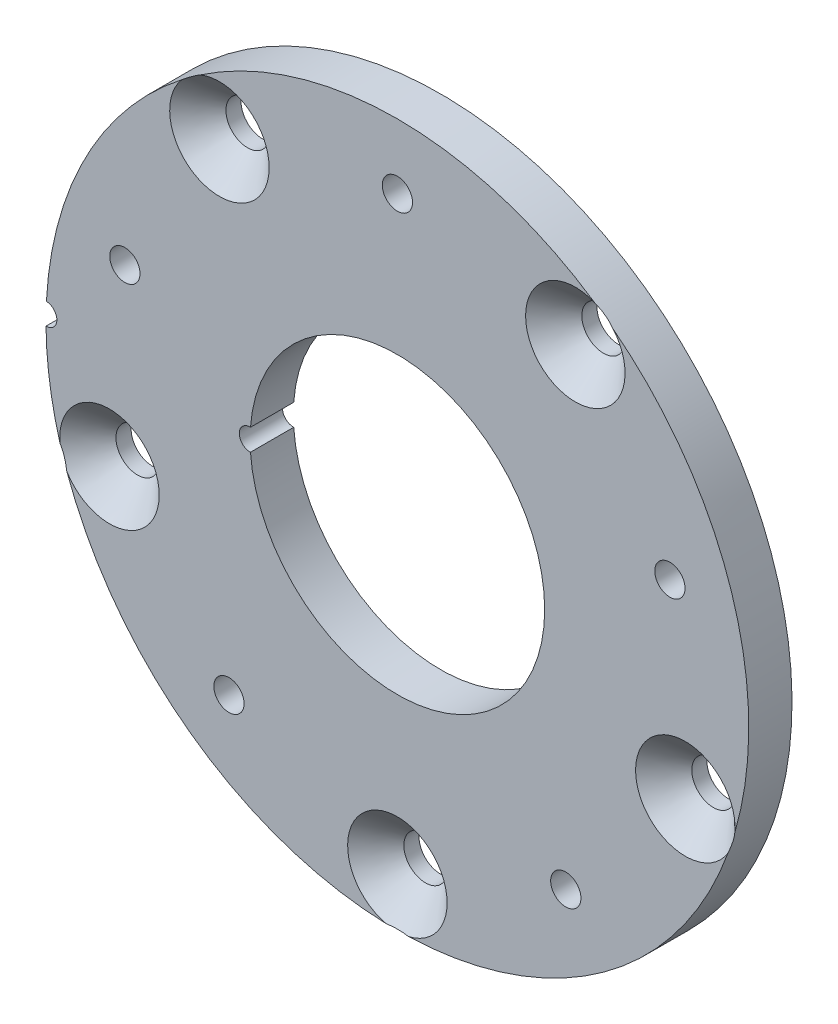
ISO-10303-21;
HEADER;
FILE_DESCRIPTION(('STEP AP214'),'2;1');
FILE_NAME('part.step','',(''),(''),'','','');
FILE_SCHEMA(('AUTOMOTIVE_DESIGN { 1 0 10303 214 1 1 1 1 }'));
ENDSEC;
DATA;
#1=APPLICATION_CONTEXT('core data for automotive mechanical design processes');
#2=APPLICATION_PROTOCOL_DEFINITION('international standard','automotive_design',2000,#1);
#3=PRODUCT_CONTEXT('',#1,'mechanical');
#4=PRODUCT('Part','Part','',(#3));
#5=PRODUCT_RELATED_PRODUCT_CATEGORY('part','',(#4));
#6=PRODUCT_DEFINITION_FORMATION('','',#4);
#7=PRODUCT_DEFINITION_CONTEXT('part definition',#1,'design');
#8=PRODUCT_DEFINITION('design','',#6,#7);
#9=PRODUCT_DEFINITION_SHAPE('','',#8);
#10=(LENGTH_UNIT() NAMED_UNIT(*) SI_UNIT(.MILLI.,.METRE.));
#11=(NAMED_UNIT(*) PLANE_ANGLE_UNIT() SI_UNIT($,.RADIAN.));
#12=(NAMED_UNIT(*) SI_UNIT($,.STERADIAN.) SOLID_ANGLE_UNIT());
#13=UNCERTAINTY_MEASURE_WITH_UNIT(LENGTH_MEASURE(1.E-05),#10,'distance_accuracy_value','');
#14=(GEOMETRIC_REPRESENTATION_CONTEXT(3) GLOBAL_UNCERTAINTY_ASSIGNED_CONTEXT((#13)) GLOBAL_UNIT_ASSIGNED_CONTEXT((#10,
#11,#12)) REPRESENTATION_CONTEXT('',''));
#15=CARTESIAN_POINT('',(0.,0.,0.));
#16=DIRECTION('',(0.,0.,1.));
#17=DIRECTION('',(1.,0.,0.));
#18=AXIS2_PLACEMENT_3D('',#15,#16,#17);
#19=CARTESIAN_POINT('',(0.,0.,4.));
#20=DIRECTION('',(0.,0.,1.));
#21=DIRECTION('',(1.,0.,0.));
#22=AXIS2_PLACEMENT_3D('',#19,#20,#21);
#23=PLANE('',#22);
#24=CARTESIAN_POINT('',(26.6295824562642,-8.65247584249883,4.));
#25=DIRECTION('',(0.,0.,1.));
#26=DIRECTION('',(0.309016994374958,0.95105651629515,0.));
#27=AXIS2_PLACEMENT_3D('',#24,#25,#26);
#28=CIRCLE('',#27,4.6);
#29=CARTESIAN_POINT('',(31.2114316098965,-9.06071392665904,4.));
#30=VERTEX_POINT('',#29);
#31=CARTESIAN_POINT('',(30.5763326125087,-11.015347655396,4.));
#32=VERTEX_POINT('',#31);
#33=EDGE_CURVE('E52',#30,#32,#28,.T.);
#34=ORIENTED_EDGE('',*,*,#33,.F.);
#35=CARTESIAN_POINT('',(0.,0.,4.));
#36=DIRECTION('',(0.,0.,1.));
#37=DIRECTION('',(1.,0.,0.));
#38=AXIS2_PLACEMENT_3D('',#35,#36,#37);
#39=CIRCLE('',#38,32.5);
#40=CARTESIAN_POINT('',(19.924824569847,25.6758907510688,4.));
#41=VERTEX_POINT('',#40);
#42=EDGE_CURVE('E59',#30,#41,#39,.T.);
#43=ORIENTED_EDGE('',*,*,#42,.T.);
#44=CARTESIAN_POINT('',(16.4579870641894,22.6524758424984,4.));
#45=DIRECTION('',(0.,0.,1.));
#46=DIRECTION('',(-0.809016994374942,0.58778525229248,0.));
#47=AXIS2_PLACEMENT_3D('',#44,#45,#46);
#48=CIRCLE('',#47,4.6);
#49=CARTESIAN_POINT('',(18.2621138084647,26.8839208309853,4.));
#50=VERTEX_POINT('',#49);
#51=EDGE_CURVE('E441',#50,#41,#48,.T.);
#52=ORIENTED_EDGE('',*,*,#51,.F.);
#53=CARTESIAN_POINT('',(-18.2621138084643,26.8839208309855,4.));
#54=VERTEX_POINT('',#53);
#55=EDGE_CURVE('E122',#50,#54,#39,.T.);
#56=ORIENTED_EDGE('',*,*,#55,.T.);
#57=CARTESIAN_POINT('',(-16.4579870641891,22.6524758424986,4.));
#58=DIRECTION('',(0.,0.,1.));
#59=DIRECTION('',(-0.809016994374951,-0.587785252292469,0.));
#60=AXIS2_PLACEMENT_3D('',#57,#58,#59);
#61=CIRCLE('',#60,4.6);
#62=CARTESIAN_POINT('',(-19.9248245698466,25.6758907510691,4.));
#63=VERTEX_POINT('',#62);
#64=EDGE_CURVE('E451',#63,#54,#61,.T.);
#65=ORIENTED_EDGE('',*,*,#64,.F.);
#66=CARTESIAN_POINT('',(-32.4582399805729,1.64701468224688,4.));
#67=VERTEX_POINT('',#66);
#68=EDGE_CURVE('E126',#63,#67,#39,.T.);
#69=ORIENTED_EDGE('',*,*,#68,.T.);
#70=CARTESIAN_POINT('',(-32.4935465104058,0.647638152128651,4.));
#71=DIRECTION('',(0.,0.,1.));
#72=DIRECTION('',(1.,0.,0.));
#73=AXIS2_PLACEMENT_3D('',#70,#71,#72);
#74=CIRCLE('',#73,0.999999999999998);
#75=CARTESIAN_POINT('',(-32.4980899192821,-0.352351526535974,4.));
#76=VERTEX_POINT('',#75);
#77=EDGE_CURVE('E220',#76,#67,#74,.T.);
#78=ORIENTED_EDGE('',*,*,#77,.F.);
#79=CARTESIAN_POINT('',(-31.2114316098967,-9.06071392665856,4.));
#80=VERTEX_POINT('',#79);
#81=EDGE_CURVE('E124',#76,#80,#39,.T.);
#82=ORIENTED_EDGE('',*,*,#81,.T.);
#83=CARTESIAN_POINT('',(-26.6295824562643,-8.65247584249845,4.));
#84=DIRECTION('',(0.,0.,1.));
#85=DIRECTION('',(0.309016994374945,-0.951056516295155,0.));
#86=AXIS2_PLACEMENT_3D('',#83,#84,#85);
#87=CIRCLE('',#86,4.6);
#88=CARTESIAN_POINT('',(-30.5763326125088,-11.0153476553956,4.));
#89=VERTEX_POINT('',#88);
#90=EDGE_CURVE('E465',#89,#80,#87,.T.);
#91=ORIENTED_EDGE('',*,*,#90,.F.);
#92=CARTESIAN_POINT('',(-1.02761176399453,-32.48375,4.));
#93=VERTEX_POINT('',#92);
#94=EDGE_CURVE('E125',#89,#93,#39,.T.);
#95=ORIENTED_EDGE('',*,*,#94,.T.);
#96=CARTESIAN_POINT('',(0.,-28.,4.));
#97=DIRECTION('',(0.,0.,1.));
#98=DIRECTION('',(1.,0.,0.));
#99=AXIS2_PLACEMENT_3D('',#96,#97,#98);
#100=CIRCLE('',#99,4.6);
#101=CARTESIAN_POINT('',(1.02761176399448,-32.48375,4.));
#102=VERTEX_POINT('',#101);
#103=EDGE_CURVE('E231',#102,#93,#100,.T.);
#104=ORIENTED_EDGE('',*,*,#103,.F.);
#105=EDGE_CURVE('E116',#102,#32,#39,.T.);
#106=ORIENTED_EDGE('',*,*,#105,.T.);
#107=EDGE_LOOP('',(#34,#43,#52,#56,#65,#69,#78,#82,#91,#95,#104,#106));
#108=FACE_BOUND('',#107,.T.);
#109=CARTESIAN_POINT('',(-13.625,0.,4.));
#110=DIRECTION('',(0.,0.,1.));
#111=DIRECTION('',(1.,0.,0.));
#112=AXIS2_PLACEMENT_3D('',#109,#110,#111);
#113=CIRCLE('',#112,1.);
#114=CARTESIAN_POINT('',(-13.5883027522936,0.999326429156548,4.));
#115=VERTEX_POINT('',#114);
#116=CARTESIAN_POINT('',(-13.5883027522936,-0.999326429156548,4.));
#117=VERTEX_POINT('',#116);
#118=EDGE_CURVE('E164',#115,#117,#113,.T.);
#119=ORIENTED_EDGE('',*,*,#118,.F.);
#120=CARTESIAN_POINT('',(0.,0.,4.));
#121=DIRECTION('',(0.,0.,1.));
#122=DIRECTION('',(1.,0.,0.));
#123=AXIS2_PLACEMENT_3D('',#120,#121,#122);
#124=CIRCLE('',#123,13.625);
#125=EDGE_CURVE('E143',#117,#115,#124,.T.);
#126=ORIENTED_EDGE('',*,*,#125,.F.);
#127=EDGE_LOOP('',(#119,#126));
#128=FACE_BOUND('',#127,.T.);
#129=CARTESIAN_POINT('',(25.2029976818217,8.188950350936,4.));
#130=DIRECTION('',(0.,0.,1.));
#131=DIRECTION('',(1.,0.,0.));
#132=AXIS2_PLACEMENT_3D('',#129,#130,#131);
#133=CIRCLE('',#132,1.4);
#134=CARTESIAN_POINT('',(26.6029976818217,8.188950350936,4.));
#135=VERTEX_POINT('',#134);
#136=EDGE_CURVE('E171',#135,#135,#133,.T.);
#137=ORIENTED_EDGE('',*,*,#136,.F.);
#138=EDGE_LOOP('',(#137));
#139=FACE_BOUND('',#138,.T.);
#140=CARTESIAN_POINT('',(-25.2029976818215,8.18895035093619,4.));
#141=DIRECTION('',(0.,0.,1.));
#142=DIRECTION('',(1.,0.,0.));
#143=AXIS2_PLACEMENT_3D('',#140,#141,#142);
#144=CIRCLE('',#143,1.4);
#145=CARTESIAN_POINT('',(-23.8029976818215,8.18895035093619,4.));
#146=VERTEX_POINT('',#145);
#147=EDGE_CURVE('E183',#146,#146,#144,.T.);
#148=ORIENTED_EDGE('',*,*,#147,.F.);
#149=EDGE_LOOP('',(#148));
#150=FACE_BOUND('',#149,.T.);
#151=CARTESIAN_POINT('',(-15.5763091857506,-21.4389503509361,4.));
#152=DIRECTION('',(0.,0.,1.));
#153=DIRECTION('',(1.,0.,0.));
#154=AXIS2_PLACEMENT_3D('',#151,#152,#153);
#155=CIRCLE('',#154,1.4);
#156=CARTESIAN_POINT('',(-14.1763091857506,-21.4389503509361,4.));
#157=VERTEX_POINT('',#156);
#158=EDGE_CURVE('E189',#157,#157,#155,.T.);
#159=ORIENTED_EDGE('',*,*,#158,.F.);
#160=EDGE_LOOP('',(#159));
#161=FACE_BOUND('',#160,.T.);
#162=CARTESIAN_POINT('',(1.54620020931789E-13,26.5,4.));
#163=DIRECTION('',(0.,0.,1.));
#164=DIRECTION('',(1.,0.,0.));
#165=AXIS2_PLACEMENT_3D('',#162,#163,#164);
#166=CIRCLE('',#165,1.4);
#167=CARTESIAN_POINT('',(1.40000000000015,26.5,4.));
#168=VERTEX_POINT('',#167);
#169=EDGE_CURVE('E177',#168,#168,#166,.T.);
#170=ORIENTED_EDGE('',*,*,#169,.F.);
#171=EDGE_LOOP('',(#170));
#172=FACE_BOUND('',#171,.T.);
#173=CARTESIAN_POINT('',(15.5763091857505,-21.4389503509362,4.));
#174=DIRECTION('',(0.,0.,1.));
#175=DIRECTION('',(1.,0.,0.));
#176=AXIS2_PLACEMENT_3D('',#173,#174,#175);
#177=CIRCLE('',#176,1.4);
#178=CARTESIAN_POINT('',(16.9763091857505,-21.4389503509362,4.));
#179=VERTEX_POINT('',#178);
#180=EDGE_CURVE('E161',#179,#179,#177,.T.);
#181=ORIENTED_EDGE('',*,*,#180,.F.);
#182=EDGE_LOOP('',(#181));
#183=FACE_BOUND('',#182,.T.);
#184=ADVANCED_FACE('F37',(#108,#128,#139,#150,#161,#172,#183),#23,.T.);
#185=CARTESIAN_POINT('',(0.,0.,0.));
#186=DIRECTION('',(0.,0.,1.));
#187=DIRECTION('',(1.,0.,0.));
#188=AXIS2_PLACEMENT_3D('',#185,#186,#187);
#189=PLANE('',#188);
#190=CARTESIAN_POINT('',(0.,0.,0.));
#191=DIRECTION('',(0.,0.,1.));
#192=DIRECTION('',(1.,0.,0.));
#193=AXIS2_PLACEMENT_3D('',#190,#191,#192);
#194=CIRCLE('',#193,32.5);
#195=CARTESIAN_POINT('',(-32.4980899192821,-0.352351526535974,0.));
#196=VERTEX_POINT('',#195);
#197=CARTESIAN_POINT('',(-32.4582399805729,1.64701468224705,0.));
#198=VERTEX_POINT('',#197);
#199=EDGE_CURVE('E138',#196,#198,#194,.T.);
#200=ORIENTED_EDGE('',*,*,#199,.F.);
#201=CARTESIAN_POINT('',(-32.4935465104058,0.647638152128651,0.));
#202=DIRECTION('',(0.,0.,1.));
#203=DIRECTION('',(1.,0.,0.));
#204=AXIS2_PLACEMENT_3D('',#201,#202,#203);
#205=CIRCLE('',#204,0.999999999999998);
#206=EDGE_CURVE('E156',#196,#198,#205,.T.);
#207=ORIENTED_EDGE('',*,*,#206,.T.);
#208=EDGE_LOOP('',(#200,#207));
#209=FACE_BOUND('',#208,.T.);
#210=CARTESIAN_POINT('',(0.,0.,0.));
#211=DIRECTION('',(0.,0.,1.));
#212=DIRECTION('',(1.,0.,0.));
#213=AXIS2_PLACEMENT_3D('',#210,#211,#212);
#214=CIRCLE('',#213,13.625);
#215=CARTESIAN_POINT('',(-13.5883027522936,-0.999326429156545,0.));
#216=VERTEX_POINT('',#215);
#217=CARTESIAN_POINT('',(-13.5883027522936,0.999326429156542,0.));
#218=VERTEX_POINT('',#217);
#219=EDGE_CURVE('E147',#216,#218,#214,.T.);
#220=ORIENTED_EDGE('',*,*,#219,.T.);
#221=CARTESIAN_POINT('',(-13.625,0.,0.));
#222=DIRECTION('',(0.,0.,1.));
#223=DIRECTION('',(1.,0.,0.));
#224=AXIS2_PLACEMENT_3D('',#221,#222,#223);
#225=CIRCLE('',#224,1.);
#226=EDGE_CURVE('E158',#218,#216,#225,.T.);
#227=ORIENTED_EDGE('',*,*,#226,.T.);
#228=EDGE_LOOP('',(#220,#227));
#229=FACE_BOUND('',#228,.T.);
#230=CARTESIAN_POINT('',(0.,-28.,0.));
#231=DIRECTION('',(0.,0.,1.));
#232=DIRECTION('',(1.,0.,0.));
#233=AXIS2_PLACEMENT_3D('',#230,#231,#232);
#234=CIRCLE('',#233,2.);
#235=CARTESIAN_POINT('',(1.99999999999999,-28.,0.));
#236=VERTEX_POINT('',#235);
#237=EDGE_CURVE('E206',#236,#236,#234,.T.);
#238=ORIENTED_EDGE('',*,*,#237,.T.);
#239=EDGE_LOOP('',(#238));
#240=FACE_BOUND('',#239,.T.);
#241=CARTESIAN_POINT('',(-26.6295824562643,-8.65247584249846,0.));
#242=DIRECTION('',(0.,0.,1.));
#243=DIRECTION('',(1.,0.,0.));
#244=AXIS2_PLACEMENT_3D('',#241,#242,#243);
#245=CIRCLE('',#244,2.);
#246=CARTESIAN_POINT('',(-24.6295824562643,-8.65247584249846,0.));
#247=VERTEX_POINT('',#246);
#248=EDGE_CURVE('E203',#247,#247,#245,.T.);
#249=ORIENTED_EDGE('',*,*,#248,.T.);
#250=EDGE_LOOP('',(#249));
#251=FACE_BOUND('',#250,.T.);
#252=CARTESIAN_POINT('',(-16.4579870641891,22.6524758424986,0.));
#253=DIRECTION('',(0.,0.,1.));
#254=DIRECTION('',(1.,0.,0.));
#255=AXIS2_PLACEMENT_3D('',#252,#253,#254);
#256=CIRCLE('',#255,2.);
#257=CARTESIAN_POINT('',(-14.4579870641891,22.6524758424986,0.));
#258=VERTEX_POINT('',#257);
#259=EDGE_CURVE('E200',#258,#258,#256,.T.);
#260=ORIENTED_EDGE('',*,*,#259,.T.);
#261=EDGE_LOOP('',(#260));
#262=FACE_BOUND('',#261,.T.);
#263=CARTESIAN_POINT('',(16.4579870641894,22.6524758424984,0.));
#264=DIRECTION('',(0.,0.,1.));
#265=DIRECTION('',(1.,0.,0.));
#266=AXIS2_PLACEMENT_3D('',#263,#264,#265);
#267=CIRCLE('',#266,2.);
#268=CARTESIAN_POINT('',(18.4579870641894,22.6524758424984,0.));
#269=VERTEX_POINT('',#268);
#270=EDGE_CURVE('E197',#269,#269,#267,.T.);
#271=ORIENTED_EDGE('',*,*,#270,.T.);
#272=EDGE_LOOP('',(#271));
#273=FACE_BOUND('',#272,.T.);
#274=CARTESIAN_POINT('',(26.6295824562642,-8.65247584249883,0.));
#275=DIRECTION('',(0.,0.,1.));
#276=DIRECTION('',(1.,0.,0.));
#277=AXIS2_PLACEMENT_3D('',#274,#275,#276);
#278=CIRCLE('',#277,2.);
#279=CARTESIAN_POINT('',(28.6295824562642,-8.65247584249883,0.));
#280=VERTEX_POINT('',#279);
#281=EDGE_CURVE('E192',#280,#280,#278,.T.);
#282=ORIENTED_EDGE('',*,*,#281,.T.);
#283=EDGE_LOOP('',(#282));
#284=FACE_BOUND('',#283,.T.);
#285=CARTESIAN_POINT('',(-15.5763091857506,-21.4389503509361,0.));
#286=DIRECTION('',(0.,0.,1.));
#287=DIRECTION('',(1.,0.,0.));
#288=AXIS2_PLACEMENT_3D('',#285,#286,#287);
#289=CIRCLE('',#288,1.4);
#290=CARTESIAN_POINT('',(-14.1763091857506,-21.4389503509361,0.));
#291=VERTEX_POINT('',#290);
#292=EDGE_CURVE('E186',#291,#291,#289,.T.);
#293=ORIENTED_EDGE('',*,*,#292,.T.);
#294=EDGE_LOOP('',(#293));
#295=FACE_BOUND('',#294,.T.);
#296=CARTESIAN_POINT('',(-25.2029976818215,8.18895035093619,0.));
#297=DIRECTION('',(0.,0.,1.));
#298=DIRECTION('',(1.,0.,0.));
#299=AXIS2_PLACEMENT_3D('',#296,#297,#298);
#300=CIRCLE('',#299,1.4);
#301=CARTESIAN_POINT('',(-23.8029976818215,8.18895035093619,0.));
#302=VERTEX_POINT('',#301);
#303=EDGE_CURVE('E180',#302,#302,#300,.T.);
#304=ORIENTED_EDGE('',*,*,#303,.T.);
#305=EDGE_LOOP('',(#304));
#306=FACE_BOUND('',#305,.T.);
#307=CARTESIAN_POINT('',(1.54620020931789E-13,26.5,0.));
#308=DIRECTION('',(0.,0.,1.));
#309=DIRECTION('',(1.,0.,0.));
#310=AXIS2_PLACEMENT_3D('',#307,#308,#309);
#311=CIRCLE('',#310,1.4);
#312=CARTESIAN_POINT('',(1.40000000000015,26.5,0.));
#313=VERTEX_POINT('',#312);
#314=EDGE_CURVE('E174',#313,#313,#311,.T.);
#315=ORIENTED_EDGE('',*,*,#314,.T.);
#316=EDGE_LOOP('',(#315));
#317=FACE_BOUND('',#316,.T.);
#318=CARTESIAN_POINT('',(25.2029976818217,8.188950350936,0.));
#319=DIRECTION('',(0.,0.,1.));
#320=DIRECTION('',(1.,0.,0.));
#321=AXIS2_PLACEMENT_3D('',#318,#319,#320);
#322=CIRCLE('',#321,1.4);
#323=CARTESIAN_POINT('',(26.6029976818217,8.188950350936,0.));
#324=VERTEX_POINT('',#323);
#325=EDGE_CURVE('E169',#324,#324,#322,.T.);
#326=ORIENTED_EDGE('',*,*,#325,.T.);
#327=EDGE_LOOP('',(#326));
#328=FACE_BOUND('',#327,.T.);
#329=CARTESIAN_POINT('',(15.5763091857505,-21.4389503509362,0.));
#330=DIRECTION('',(0.,0.,1.));
#331=DIRECTION('',(1.,0.,0.));
#332=AXIS2_PLACEMENT_3D('',#329,#330,#331);
#333=CIRCLE('',#332,1.4);
#334=CARTESIAN_POINT('',(16.9763091857505,-21.4389503509362,0.));
#335=VERTEX_POINT('',#334);
#336=EDGE_CURVE('E157',#335,#335,#333,.T.);
#337=ORIENTED_EDGE('',*,*,#336,.T.);
#338=EDGE_LOOP('',(#337));
#339=FACE_BOUND('',#338,.T.);
#340=ADVANCED_FACE('F154',(#209,#229,#240,#251,#262,#273,#284,#295,#306,#317,#328,#339),#189,.F.);
#341=CARTESIAN_POINT('',(0.,0.,4.));
#342=DIRECTION('',(0.,0.,-1.));
#343=DIRECTION('',(-1.,0.,0.));
#344=AXIS2_PLACEMENT_3D('',#341,#342,#343);
#345=CYLINDRICAL_SURFACE('',#344,32.5);
#346=ORIENTED_EDGE('',*,*,#42,.F.);
#347=CARTESIAN_POINT('',(29.7642821915229,-13.05134114271,4.80151445056223));
#348=CARTESIAN_POINT('',(29.7990954753925,-12.9719464974156,4.75706565626101));
#349=CARTESIAN_POINT('',(29.8337921862947,-12.8919561239771,4.7135922698184));
#350=CARTESIAN_POINT('',(29.9029638009744,-12.7306897995468,4.62885638173554));
#351=CARTESIAN_POINT('',(29.9374386455946,-12.6494135241654,4.58759444987117));
#352=CARTESIAN_POINT('',(30.0407354269776,-12.4030640163051,4.46729963383827));
#353=CARTESIAN_POINT('',(30.1092120263845,-12.2359654356075,4.39203901050532));
#354=CARTESIAN_POINT('',(30.2449481691323,-11.8964887970887,4.25447046684947));
#355=CARTESIAN_POINT('',(30.3122101393635,-11.7241236983948,4.19213329443923));
#356=CARTESIAN_POINT('',(30.4452972298894,-11.3740428620976,4.08343940363289));
#357=CARTESIAN_POINT('',(30.5111240865307,-11.1963342895338,4.03706224002949));
#358=CARTESIAN_POINT('',(30.625798218446,-10.8780556779291,3.97188531633565));
#359=CARTESIAN_POINT('',(30.6750433406051,-10.7384289761772,3.94918454061495));
#360=CARTESIAN_POINT('',(30.772059114663,-10.4571743379573,3.9161059294156));
#361=CARTESIAN_POINT('',(30.8198296406019,-10.3155462320276,3.90572914382985));
#362=CARTESIAN_POINT('',(30.91345580336,-10.0314797995512,3.89787763744971));
#363=CARTESIAN_POINT('',(30.9593136019127,-9.88904260642992,3.90038793037042));
#364=CARTESIAN_POINT('',(31.0488250920257,-9.60430845773261,3.9181282488439));
#365=CARTESIAN_POINT('',(31.0924790707949,-9.46201148626471,3.93335661237586));
#366=CARTESIAN_POINT('',(31.189249567325,-9.13874088146984,3.98169045081677));
#367=CARTESIAN_POINT('',(31.2415894063599,-8.95810404197802,4.01860993030227));
#368=CARTESIAN_POINT('',(31.3421221908425,-8.59977290554906,4.10936636804301));
#369=CARTESIAN_POINT('',(31.3903092934516,-8.42208302972639,4.16322668223493));
#370=CARTESIAN_POINT('',(31.4829218127849,-8.0690301239286,4.28522390764091));
#371=CARTESIAN_POINT('',(31.5273130937003,-7.89369817940568,4.35347441213314));
#372=CARTESIAN_POINT('',(31.6119933462984,-7.54741522301577,4.50093199539019));
#373=CARTESIAN_POINT('',(31.6522960570481,-7.37645108832062,4.58010011684573));
#374=CARTESIAN_POINT('',(31.6907607950203,-7.20733516861825,4.66345492466674));
#375=B_SPLINE_CURVE_WITH_KNOTS('',3,(#347,#348,#349,#350,#351,#352,#353,#354,#355,#356,#357,
#358,#359,#360,#361,#362,#363,#364,#365,#366,#367,#368,#369,#370,#371,#372,#373,#374),
.UNSPECIFIED.,.F.,.F.,(4,2,2,2,2,2,2,2,2,2,2,2,2,4),(0.,0.292254819691221,0.584584579673453,
1.17107092677199,1.75621491455109,2.34060650198234,2.78949031699162,3.23841237011422,
3.68681249355796,4.13515402841842,4.70914235390499,5.28392551833602,5.8634282028859,
6.44091412228892),.UNSPECIFIED.);
#376=EDGE_CURVE('E107',#30,#32,#375,.F.);
#377=ORIENTED_EDGE('',*,*,#376,.T.);
#378=ORIENTED_EDGE('',*,*,#105,.F.);
#379=CARTESIAN_POINT('',(2.18761147687946,-32.4262911235039,4.33737755126989));
#380=CARTESIAN_POINT('',(2.09392339413747,-32.4326111129845,4.30153893209606));
#381=CARTESIAN_POINT('',(1.99958106501111,-32.4385683271193,4.26736311533428));
#382=CARTESIAN_POINT('',(1.80952219744727,-32.4497259358619,4.20274766679111));
#383=CARTESIAN_POINT('',(1.71380488412545,-32.4549258837221,4.17231024211095));
#384=CARTESIAN_POINT('',(1.42362940338324,-32.4693835891835,4.08698028514288));
#385=CARTESIAN_POINT('',(1.22714799405356,-32.4774309221458,4.03846227431315));
#386=CARTESIAN_POINT('',(0.881592837675937,-32.4883742806242,3.97185344035491));
#387=CARTESIAN_POINT('',(0.73342890122717,-32.4920648200495,3.94913581277253));
#388=CARTESIAN_POINT('',(0.435627077287493,-32.4974213151129,3.91604774106234));
#389=CARTESIAN_POINT('',(0.285988902893382,-32.4990868684938,3.90567975015933));
#390=CARTESIAN_POINT('',(-0.0131395925682458,-32.50034046349,3.8978828125145));
#391=CARTESIAN_POINT('',(-0.162628801430454,-32.4999352698523,3.90041173389155));
#392=CARTESIAN_POINT('',(-0.46076951465051,-32.4970752348678,3.91817038711729));
#393=CARTESIAN_POINT('',(-0.60942139569541,-32.4946214041906,3.93339385626411));
#394=CARTESIAN_POINT('',(-0.802587960114542,-32.4901204174539,3.96106299954777));
#395=CARTESIAN_POINT('',(-0.847945584161226,-32.4889679517612,3.96813446268651));
#396=CARTESIAN_POINT('',(-0.938452342538747,-32.4864795838151,3.98336137216999));
#397=CARTESIAN_POINT('',(-0.98360156342662,-32.4851437664625,3.99151631675431));
#398=CARTESIAN_POINT('',(-1.21942079098708,-32.4776756682963,4.03697369332571));
#399=CARTESIAN_POINT('',(-1.40838256964405,-32.4700057020977,4.08322955410041));
#400=CARTESIAN_POINT('',(-1.78162105507351,-32.4516692381705,4.19160061006673));
#401=CARTESIAN_POINT('',(-1.96589251800099,-32.4409995344591,4.25373276660941));
#402=CARTESIAN_POINT('',(-2.33044003473332,-32.4168567948062,4.39106744432792));
#403=CARTESIAN_POINT('',(-2.51068793137564,-32.403368392982,4.4663412194918));
#404=CARTESIAN_POINT('',(-2.86630546106086,-32.3738493773682,4.62693861356627));
#405=CARTESIAN_POINT('',(-3.04167661824324,-32.3578195685894,4.71225904792318));
#406=CARTESIAN_POINT('',(-3.43434892285811,-32.3187856394079,4.91459509950438));
#407=CARTESIAN_POINT('',(-3.65034678795546,-32.2950620212775,5.03399184547994));
#408=CARTESIAN_POINT('',(-3.96880432382042,-32.2569349366156,5.21940150205408));
#409=CARTESIAN_POINT('',(-4.07350186700296,-32.2438768767346,5.28191506257402));
#410=CARTESIAN_POINT('',(-4.28156490962763,-32.216908560319,5.40892305131055));
#411=CARTESIAN_POINT('',(-4.38493053350623,-32.2029983841036,5.47341729254628));
#412=CARTESIAN_POINT('',(-4.48769978419368,-32.1886711537918,5.53876334351306));
#413=B_SPLINE_CURVE_WITH_KNOTS('',3,(#379,#380,#381,#382,#383,#384,#385,#386,#387,#388,#389,
#390,#391,#392,#393,#394,#395,#396,#397,#398,#399,#400,#401,#402,#403,#404,#405,#406,#407,#408,
#409,#410,#411,#412),.UNSPECIFIED.,.F.,.F.,(4,2,2,2,2,2,2,2,2,2,2,2,2,2,2,2,4),(0.,
0.301485882887291,0.603148912406607,1.20969485911814,1.65905369009797,2.10850177022017,
2.55648252712252,3.00424240878819,3.14199402554852,3.27968207043328,3.86276390264171,
4.44647129067722,5.03344783681443,5.62023882357679,6.36366391174606,6.73155944677986,
7.09942035773564),.UNSPECIFIED.);
#414=EDGE_CURVE('E222',#102,#93,#413,.T.);
#415=ORIENTED_EDGE('',*,*,#414,.T.);
#416=ORIENTED_EDGE('',*,*,#94,.F.);
#417=CARTESIAN_POINT('',(-30.5759805592863,-11.0163248335435,4.0002));
#418=CARTESIAN_POINT('',(-30.6011931699026,-10.9463473958009,3.98586800496713));
#419=CARTESIAN_POINT('',(-30.6262575070638,-10.8760267650966,3.97297614819914));
#420=CARTESIAN_POINT('',(-30.676053560222,-10.7347727992436,3.95021002917064));
#421=CARTESIAN_POINT('',(-30.7007852349056,-10.6638393897578,3.94033613846361));
#422=CARTESIAN_POINT('',(-30.7744041508496,-10.4502963423114,3.9154568680967));
#423=CARTESIAN_POINT('',(-30.8227294310869,-10.306904649462,3.90518571828497));
#424=CARTESIAN_POINT('',(-30.9162705408148,-10.022775536683,3.89795657955918));
#425=CARTESIAN_POINT('',(-30.9615339529008,-9.88206170537228,3.90067126017088));
#426=CARTESIAN_POINT('',(-31.0498989922163,-9.60080728491697,3.91850384110028));
#427=CARTESIAN_POINT('',(-31.0930013451044,-9.46026665328687,3.9336175479667));
#428=CARTESIAN_POINT('',(-31.1885735977248,-9.14099918343215,3.9813527279751));
#429=CARTESIAN_POINT('',(-31.2402861063589,-8.96260155497331,4.0176921220049));
#430=CARTESIAN_POINT('',(-31.3396363981531,-8.60877572180096,4.10687245624813));
#431=CARTESIAN_POINT('',(-31.3872714933109,-8.43334953617779,4.15972417695593));
#432=CARTESIAN_POINT('',(-31.4564889844985,-8.16994091519101,4.25017381861741));
#433=CARTESIAN_POINT('',(-31.4795535798393,-8.08060093670968,4.28283021540552));
#434=CARTESIAN_POINT('',(-31.5246233961358,-7.902943212993,4.35136410780085));
#435=CARTESIAN_POINT('',(-31.5466291274233,-7.81462499122108,4.3872400273438));
#436=CARTESIAN_POINT('',(-31.5895470624973,-7.63928248243777,4.46172590921883));
#437=CARTESIAN_POINT('',(-31.6104629225202,-7.55225467853746,4.50032554890045));
#438=CARTESIAN_POINT('',(-31.6513285728823,-7.37911286740737,4.58006550528817));
#439=CARTESIAN_POINT('',(-31.6712781277644,-7.29299908684713,4.62120643572267));
#440=CARTESIAN_POINT('',(-31.6907607950204,-7.20733516861785,4.66345492466671));
#441=B_SPLINE_CURVE_WITH_KNOTS('',3,(#417,#418,#419,#420,#421,#422,#423,#424,#425,#426,#427,
#428,#429,#430,#431,#432,#433,#434,#435,#436,#437,#438,#439,#440),.UNSPECIFIED.,.F.,.F.,(4,2,2,
2,2,2,2,2,2,2,2,4),(0.,0.227220223808057,0.454468410320775,0.908837681842531,1.35181502821111,
1.79464261778052,2.36149429855849,2.92871683903757,3.22229780001807,3.51573581919487,
3.80811597648137,4.10056702252247),.UNSPECIFIED.);
#442=EDGE_CURVE('E467',#89,#80,#441,.T.);
#443=ORIENTED_EDGE('',*,*,#442,.T.);
#444=ORIENTED_EDGE('',*,*,#81,.F.);
#445=DIRECTION('',(0.,0.,1.));
#446=VECTOR('',#445,1.);
#447=CARTESIAN_POINT('',(-32.4980899192821,-0.352351526535974,-1.));
#448=LINE('',#447,#446);
#449=EDGE_CURVE('E46',#76,#196,#448,.F.);
#450=ORIENTED_EDGE('',*,*,#449,.T.);
#451=ORIENTED_EDGE('',*,*,#199,.T.);
#452=DIRECTION('',(0.,0.,1.));
#453=VECTOR('',#452,1.);
#454=CARTESIAN_POINT('',(-32.4582399805729,1.64701468224688,-1.));
#455=LINE('',#454,#453);
#456=EDGE_CURVE('E11',#198,#67,#455,.T.);
#457=ORIENTED_EDGE('',*,*,#456,.T.);
#458=ORIENTED_EDGE('',*,*,#68,.F.);
#459=CARTESIAN_POINT('',(-19.925645131063,25.6752539639035,4.0002));
#460=CARTESIAN_POINT('',(-19.8671675378869,25.720636545332,3.98593735478641));
#461=CARTESIAN_POINT('',(-19.8083215611718,25.7659843440289,3.97310081513122));
#462=CARTESIAN_POINT('',(-19.6899493926026,25.8565552260342,3.95041540303593));
#463=CARTESIAN_POINT('',(-19.6304231078305,25.9017782912332,3.9405669438998));
#464=CARTESIAN_POINT('',(-19.4509168337273,26.0371710586574,3.91571003299909));
#465=CARTESIAN_POINT('',(-19.3300253280098,26.1270519844775,3.90539399261963));
#466=CARTESIAN_POINT('',(-19.0886928365942,26.3038749570467,3.89792261871008));
#467=CARTESIAN_POINT('',(-18.9682754364663,26.3908410133248,3.90055993507108));
#468=CARTESIAN_POINT('',(-18.7269467542204,26.5626312431716,3.91836898972513));
#469=CARTESIAN_POINT('',(-18.6060358696728,26.6474568515843,3.93353208824595));
#470=CARTESIAN_POINT('',(-18.4479620405017,26.756770429297,3.96105314634714));
#471=CARTESIAN_POINT('',(-18.4106452142828,26.7824604929553,3.96811300361171));
#472=CARTESIAN_POINT('',(-18.3359611701314,26.8336464081234,3.98333740134378));
#473=CARTESIAN_POINT('',(-18.29859406288,26.8591416054525,3.99150468614147));
#474=CARTESIAN_POINT('',(-18.2612546205202,26.8845044530214,4.0002));
#475=B_SPLINE_CURVE_WITH_KNOTS('',3,(#459,#460,#461,#462,#463,#464,#465,#466,#467,#468,#469,
#470,#471,#472,#473,#474),.UNSPECIFIED.,.F.,.F.,(4,2,2,2,2,2,2,4),(0.,0.22612249905802,
0.452276260581497,0.904645143570289,1.34979658315466,1.79464123161286,1.93218740960414,
2.07008089376955),.UNSPECIFIED.);
#476=EDGE_CURVE('E454',#63,#54,#475,.T.);
#477=ORIENTED_EDGE('',*,*,#476,.T.);
#478=ORIENTED_EDGE('',*,*,#55,.F.);
#479=CARTESIAN_POINT('',(18.2612546205206,26.8845044530212,4.0002));
#480=CARTESIAN_POINT('',(18.322486590396,26.8429129458838,3.98593735478641));
#481=CARTESIAN_POINT('',(18.383799316702,26.8009603367259,3.97310081513122));
#482=CARTESIAN_POINT('',(18.5065163559686,26.7163696561953,3.95041540303593));
#483=CARTESIAN_POINT('',(18.5679206804195,26.6737314908563,3.9405669438998));
#484=CARTESIAN_POINT('',(18.7521573434324,26.544849545204,3.91571003299909));
#485=CARTESIAN_POINT('',(18.8749967133664,26.4576496244753,3.90539399261963));
#486=CARTESIAN_POINT('',(19.1177411948013,26.2827700894404,3.89792261871008));
#487=CARTESIAN_POINT('',(19.2376618523791,26.1951203256973,3.90055993507109));
#488=CARTESIAN_POINT('',(19.4756187339548,26.0186892103685,3.91836898972513));
#489=CARTESIAN_POINT('',(19.5936561997145,25.9299086802863,3.93353208824595));
#490=CARTESIAN_POINT('',(19.7464670896976,25.8133512882265,3.96105314634714));
#491=CARTESIAN_POINT('',(19.7824313256215,25.7857995437406,3.96811300361172));
#492=CARTESIAN_POINT('',(19.8541906626361,25.7305881145467,3.98333740134378));
#493=CARTESIAN_POINT('',(19.8899851073616,25.7029283329498,3.99150468614148));
#494=CARTESIAN_POINT('',(19.9256451310634,25.6752539639032,4.0002));
#495=B_SPLINE_CURVE_WITH_KNOTS('',3,(#479,#480,#481,#482,#483,#484,#485,#486,#487,#488,#489,
#490,#491,#492,#493,#494),.UNSPECIFIED.,.F.,.F.,(4,2,2,2,2,2,2,4),(0.,0.226122499058019,
0.452276260581496,0.904645143570284,1.34979658315466,1.79464123161287,1.93218740960414,
2.07008089376954),.UNSPECIFIED.);
#496=EDGE_CURVE('E121',#50,#41,#495,.T.);
#497=ORIENTED_EDGE('',*,*,#496,.T.);
#498=EDGE_LOOP('',(#346,#377,#378,#415,#416,#443,#444,#450,#451,#457,#458,#477,#478,#497));
#499=FACE_BOUND('',#498,.T.);
#500=ADVANCED_FACE('F39',(#499),#345,.T.);
#501=CARTESIAN_POINT('',(0.,0.,4.));
#502=DIRECTION('',(0.,0.,-1.));
#503=DIRECTION('',(-1.,0.,0.));
#504=AXIS2_PLACEMENT_3D('',#501,#502,#503);
#505=CYLINDRICAL_SURFACE('',#504,13.625);
#506=DIRECTION('',(0.,0.,1.));
#507=VECTOR('',#506,1.);
#508=CARTESIAN_POINT('',(-13.5883027522936,0.999326429156548,-1.));
#509=LINE('',#508,#507);
#510=EDGE_CURVE('E134',#218,#115,#509,.T.);
#511=ORIENTED_EDGE('',*,*,#510,.F.);
#512=ORIENTED_EDGE('',*,*,#219,.F.);
#513=DIRECTION('',(0.,0.,1.));
#514=VECTOR('',#513,1.);
#515=CARTESIAN_POINT('',(-13.5883027522936,-0.999326429156548,-1.));
#516=LINE('',#515,#514);
#517=EDGE_CURVE('E130',#117,#216,#516,.F.);
#518=ORIENTED_EDGE('',*,*,#517,.F.);
#519=ORIENTED_EDGE('',*,*,#125,.T.);
#520=EDGE_LOOP('',(#511,#512,#518,#519));
#521=FACE_BOUND('',#520,.T.);
#522=ADVANCED_FACE('F214',(#521),#505,.F.);
#523=CARTESIAN_POINT('',(0.,-28.,4.));
#524=DIRECTION('',(0.,0.,-1.));
#525=DIRECTION('',(-1.,0.,0.));
#526=AXIS2_PLACEMENT_3D('',#523,#524,#525);
#527=CYLINDRICAL_SURFACE('',#526,2.);
#528=CARTESIAN_POINT('',(0.,-28.,1.4));
#529=DIRECTION('',(0.,0.,1.));
#530=DIRECTION('',(1.,0.,0.));
#531=AXIS2_PLACEMENT_3D('',#528,#529,#530);
#532=CIRCLE('',#531,2.);
#533=CARTESIAN_POINT('',(2.,-28.,1.4));
#534=VERTEX_POINT('',#533);
#535=EDGE_CURVE('E472',#534,#534,#532,.T.);
#536=ORIENTED_EDGE('',*,*,#535,.T.);
#537=EDGE_LOOP('',(#536));
#538=FACE_BOUND('',#537,.T.);
#539=ORIENTED_EDGE('',*,*,#237,.F.);
#540=EDGE_LOOP('',(#539));
#541=FACE_BOUND('',#540,.T.);
#542=ADVANCED_FACE('F282',(#538,#541),#527,.F.);
#543=CARTESIAN_POINT('',(-26.6295824562643,-8.65247584249846,4.));
#544=DIRECTION('',(0.,0.,-1.));
#545=DIRECTION('',(-1.,0.,0.));
#546=AXIS2_PLACEMENT_3D('',#543,#544,#545);
#547=CYLINDRICAL_SURFACE('',#546,2.);
#548=CARTESIAN_POINT('',(-26.6295824562643,-8.65247584249845,1.4));
#549=DIRECTION('',(0.,0.,1.));
#550=DIRECTION('',(0.309016994374945,-0.951056516295155,0.));
#551=AXIS2_PLACEMENT_3D('',#548,#549,#550);
#552=CIRCLE('',#551,2.);
#553=CARTESIAN_POINT('',(-26.0115484675144,-10.5545888750888,1.4));
#554=VERTEX_POINT('',#553);
#555=EDGE_CURVE('E461',#554,#554,#552,.T.);
#556=ORIENTED_EDGE('',*,*,#555,.T.);
#557=EDGE_LOOP('',(#556));
#558=FACE_BOUND('',#557,.T.);
#559=ORIENTED_EDGE('',*,*,#248,.F.);
#560=EDGE_LOOP('',(#559));
#561=FACE_BOUND('',#560,.T.);
#562=ADVANCED_FACE('F278',(#558,#561),#547,.F.);
#563=CARTESIAN_POINT('',(-16.4579870641891,22.6524758424986,4.));
#564=DIRECTION('',(0.,0.,-1.));
#565=DIRECTION('',(-1.,0.,0.));
#566=AXIS2_PLACEMENT_3D('',#563,#564,#565);
#567=CYLINDRICAL_SURFACE('',#566,2.);
#568=CARTESIAN_POINT('',(-16.4579870641891,22.6524758424986,1.4));
#569=DIRECTION('',(0.,0.,1.));
#570=DIRECTION('',(-0.809016994374951,-0.587785252292469,0.));
#571=AXIS2_PLACEMENT_3D('',#568,#569,#570);
#572=CIRCLE('',#571,2.);
#573=CARTESIAN_POINT('',(-18.076021052939,21.4769053379137,1.4));
#574=VERTEX_POINT('',#573);
#575=EDGE_CURVE('E448',#574,#574,#572,.T.);
#576=ORIENTED_EDGE('',*,*,#575,.T.);
#577=EDGE_LOOP('',(#576));
#578=FACE_BOUND('',#577,.T.);
#579=ORIENTED_EDGE('',*,*,#259,.F.);
#580=EDGE_LOOP('',(#579));
#581=FACE_BOUND('',#580,.T.);
#582=ADVANCED_FACE('F274',(#578,#581),#567,.F.);
#583=CARTESIAN_POINT('',(16.4579870641894,22.6524758424984,4.));
#584=DIRECTION('',(0.,0.,-1.));
#585=DIRECTION('',(-1.,0.,0.));
#586=AXIS2_PLACEMENT_3D('',#583,#584,#585);
#587=CYLINDRICAL_SURFACE('',#586,2.);
#588=CARTESIAN_POINT('',(16.4579870641894,22.6524758424984,1.4));
#589=DIRECTION('',(0.,0.,1.));
#590=DIRECTION('',(-0.809016994374942,0.58778525229248,0.));
#591=AXIS2_PLACEMENT_3D('',#588,#589,#590);
#592=CIRCLE('',#591,2.);
#593=CARTESIAN_POINT('',(14.8399530754396,23.8280463470833,1.4));
#594=VERTEX_POINT('',#593);
#595=EDGE_CURVE('E112',#594,#594,#592,.T.);
#596=ORIENTED_EDGE('',*,*,#595,.T.);
#597=EDGE_LOOP('',(#596));
#598=FACE_BOUND('',#597,.T.);
#599=ORIENTED_EDGE('',*,*,#270,.F.);
#600=EDGE_LOOP('',(#599));
#601=FACE_BOUND('',#600,.T.);
#602=ADVANCED_FACE('F270',(#598,#601),#587,.F.);
#603=CARTESIAN_POINT('',(26.6295824562642,-8.65247584249883,4.));
#604=DIRECTION('',(0.,0.,-1.));
#605=DIRECTION('',(-1.,0.,0.));
#606=AXIS2_PLACEMENT_3D('',#603,#604,#605);
#607=CYLINDRICAL_SURFACE('',#606,2.);
#608=CARTESIAN_POINT('',(26.6295824562642,-8.65247584249883,1.4));
#609=DIRECTION('',(0.,0.,1.));
#610=DIRECTION('',(0.309016994374958,0.95105651629515,0.));
#611=AXIS2_PLACEMENT_3D('',#608,#609,#610);
#612=CIRCLE('',#611,2.);
#613=CARTESIAN_POINT('',(27.2476164450141,-6.75036280990853,1.4));
#614=VERTEX_POINT('',#613);
#615=EDGE_CURVE('E117',#614,#614,#612,.T.);
#616=ORIENTED_EDGE('',*,*,#615,.T.);
#617=EDGE_LOOP('',(#616));
#618=FACE_BOUND('',#617,.T.);
#619=ORIENTED_EDGE('',*,*,#281,.F.);
#620=EDGE_LOOP('',(#619));
#621=FACE_BOUND('',#620,.T.);
#622=ADVANCED_FACE('F266',(#618,#621),#607,.F.);
#623=CARTESIAN_POINT('',(-15.5763091857506,-21.4389503509361,4.));
#624=DIRECTION('',(0.,0.,-1.));
#625=DIRECTION('',(-1.,0.,0.));
#626=AXIS2_PLACEMENT_3D('',#623,#624,#625);
#627=CYLINDRICAL_SURFACE('',#626,1.4);
#628=ORIENTED_EDGE('',*,*,#158,.T.);
#629=EDGE_LOOP('',(#628));
#630=FACE_BOUND('',#629,.T.);
#631=ORIENTED_EDGE('',*,*,#292,.F.);
#632=EDGE_LOOP('',(#631));
#633=FACE_BOUND('',#632,.T.);
#634=ADVANCED_FACE('F262',(#630,#633),#627,.F.);
#635=CARTESIAN_POINT('',(-25.2029976818215,8.18895035093619,4.));
#636=DIRECTION('',(0.,0.,-1.));
#637=DIRECTION('',(-1.,0.,0.));
#638=AXIS2_PLACEMENT_3D('',#635,#636,#637);
#639=CYLINDRICAL_SURFACE('',#638,1.4);
#640=ORIENTED_EDGE('',*,*,#147,.T.);
#641=EDGE_LOOP('',(#640));
#642=FACE_BOUND('',#641,.T.);
#643=ORIENTED_EDGE('',*,*,#303,.F.);
#644=EDGE_LOOP('',(#643));
#645=FACE_BOUND('',#644,.T.);
#646=ADVANCED_FACE('F258',(#642,#645),#639,.F.);
#647=CARTESIAN_POINT('',(1.54620020931789E-13,26.5,4.));
#648=DIRECTION('',(0.,0.,-1.));
#649=DIRECTION('',(-1.,0.,0.));
#650=AXIS2_PLACEMENT_3D('',#647,#648,#649);
#651=CYLINDRICAL_SURFACE('',#650,1.4);
#652=ORIENTED_EDGE('',*,*,#169,.T.);
#653=EDGE_LOOP('',(#652));
#654=FACE_BOUND('',#653,.T.);
#655=ORIENTED_EDGE('',*,*,#314,.F.);
#656=EDGE_LOOP('',(#655));
#657=FACE_BOUND('',#656,.T.);
#658=ADVANCED_FACE('F254',(#654,#657),#651,.F.);
#659=CARTESIAN_POINT('',(25.2029976818217,8.188950350936,4.));
#660=DIRECTION('',(0.,0.,-1.));
#661=DIRECTION('',(-1.,0.,0.));
#662=AXIS2_PLACEMENT_3D('',#659,#660,#661);
#663=CYLINDRICAL_SURFACE('',#662,1.4);
#664=ORIENTED_EDGE('',*,*,#136,.T.);
#665=EDGE_LOOP('',(#664));
#666=FACE_BOUND('',#665,.T.);
#667=ORIENTED_EDGE('',*,*,#325,.F.);
#668=EDGE_LOOP('',(#667));
#669=FACE_BOUND('',#668,.T.);
#670=ADVANCED_FACE('F250',(#666,#669),#663,.F.);
#671=CARTESIAN_POINT('',(15.5763091857505,-21.4389503509362,4.));
#672=DIRECTION('',(0.,0.,-1.));
#673=DIRECTION('',(-1.,0.,0.));
#674=AXIS2_PLACEMENT_3D('',#671,#672,#673);
#675=CYLINDRICAL_SURFACE('',#674,1.4);
#676=ORIENTED_EDGE('',*,*,#180,.T.);
#677=EDGE_LOOP('',(#676));
#678=FACE_BOUND('',#677,.T.);
#679=ORIENTED_EDGE('',*,*,#336,.F.);
#680=EDGE_LOOP('',(#679));
#681=FACE_BOUND('',#680,.T.);
#682=ADVANCED_FACE('F245',(#678,#681),#675,.F.);
#683=CARTESIAN_POINT('',(-13.625,0.,-6.));
#684=DIRECTION('',(0.,0.,1.));
#685=DIRECTION('',(1.,0.,0.));
#686=AXIS2_PLACEMENT_3D('',#683,#684,#685);
#687=CYLINDRICAL_SURFACE('',#686,1.);
#688=ORIENTED_EDGE('',*,*,#510,.T.);
#689=ORIENTED_EDGE('',*,*,#118,.T.);
#690=ORIENTED_EDGE('',*,*,#517,.T.);
#691=ORIENTED_EDGE('',*,*,#226,.F.);
#692=EDGE_LOOP('',(#688,#689,#690,#691));
#693=FACE_BOUND('',#692,.T.);
#694=ADVANCED_FACE('F218',(#693),#687,.F.);
#695=CARTESIAN_POINT('',(-32.4935465104058,0.647638152128651,-6.));
#696=DIRECTION('',(0.,0.,1.));
#697=DIRECTION('',(1.,0.,0.));
#698=AXIS2_PLACEMENT_3D('',#695,#696,#697);
#699=CYLINDRICAL_SURFACE('',#698,0.999999999999998);
#700=ORIENTED_EDGE('',*,*,#206,.F.);
#701=ORIENTED_EDGE('',*,*,#449,.F.);
#702=ORIENTED_EDGE('',*,*,#77,.T.);
#703=ORIENTED_EDGE('',*,*,#456,.F.);
#704=EDGE_LOOP('',(#700,#701,#702,#703));
#705=FACE_BOUND('',#704,.T.);
#706=ADVANCED_FACE('F239',(#705),#699,.F.);
#707=CARTESIAN_POINT('',(0.,-28.,4.));
#708=DIRECTION('',(0.,0.,1.));
#709=DIRECTION('',(1.,0.,0.));
#710=AXIS2_PLACEMENT_3D('',#707,#708,#709);
#711=CONICAL_SURFACE('',#710,4.6,0.785398163397448);
#712=ORIENTED_EDGE('',*,*,#535,.F.);
#713=EDGE_LOOP('',(#712));
#714=FACE_BOUND('',#713,.T.);
#715=ORIENTED_EDGE('',*,*,#103,.T.);
#716=ORIENTED_EDGE('',*,*,#414,.F.);
#717=EDGE_LOOP('',(#715,#716));
#718=FACE_BOUND('',#717,.T.);
#719=ADVANCED_FACE('F233',(#714,#718),#711,.F.);
#720=CARTESIAN_POINT('',(-26.6295824562643,-8.65247584249845,4.));
#721=DIRECTION('',(0.,0.,1.));
#722=DIRECTION('',(0.309016994374945,-0.951056516295155,0.));
#723=AXIS2_PLACEMENT_3D('',#720,#721,#722);
#724=CONICAL_SURFACE('',#723,4.6,0.785398163397448);
#725=ORIENTED_EDGE('',*,*,#555,.F.);
#726=EDGE_LOOP('',(#725));
#727=FACE_BOUND('',#726,.T.);
#728=ORIENTED_EDGE('',*,*,#90,.T.);
#729=ORIENTED_EDGE('',*,*,#442,.F.);
#730=EDGE_LOOP('',(#728,#729));
#731=FACE_BOUND('',#730,.T.);
#732=ADVANCED_FACE('F238',(#727,#731),#724,.F.);
#733=CARTESIAN_POINT('',(-16.4579870641891,22.6524758424986,4.));
#734=DIRECTION('',(0.,0.,1.));
#735=DIRECTION('',(-0.809016994374951,-0.587785252292469,0.));
#736=AXIS2_PLACEMENT_3D('',#733,#734,#735);
#737=CONICAL_SURFACE('',#736,4.6,0.785398163397448);
#738=ORIENTED_EDGE('',*,*,#575,.F.);
#739=EDGE_LOOP('',(#738));
#740=FACE_BOUND('',#739,.T.);
#741=ORIENTED_EDGE('',*,*,#64,.T.);
#742=ORIENTED_EDGE('',*,*,#476,.F.);
#743=EDGE_LOOP('',(#741,#742));
#744=FACE_BOUND('',#743,.T.);
#745=ADVANCED_FACE('F359',(#740,#744),#737,.F.);
#746=CARTESIAN_POINT('',(16.4579870641894,22.6524758424984,4.));
#747=DIRECTION('',(0.,0.,1.));
#748=DIRECTION('',(-0.809016994374942,0.58778525229248,0.));
#749=AXIS2_PLACEMENT_3D('',#746,#747,#748);
#750=CONICAL_SURFACE('',#749,4.6,0.785398163397448);
#751=ORIENTED_EDGE('',*,*,#595,.F.);
#752=EDGE_LOOP('',(#751));
#753=FACE_BOUND('',#752,.T.);
#754=ORIENTED_EDGE('',*,*,#51,.T.);
#755=ORIENTED_EDGE('',*,*,#496,.F.);
#756=EDGE_LOOP('',(#754,#755));
#757=FACE_BOUND('',#756,.T.);
#758=ADVANCED_FACE('F366',(#753,#757),#750,.F.);
#759=CARTESIAN_POINT('',(26.6295824562642,-8.65247584249883,4.));
#760=DIRECTION('',(0.,0.,1.));
#761=DIRECTION('',(0.309016994374958,0.95105651629515,0.));
#762=AXIS2_PLACEMENT_3D('',#759,#760,#761);
#763=CONICAL_SURFACE('',#762,4.6,0.785398163397448);
#764=ORIENTED_EDGE('',*,*,#615,.F.);
#765=EDGE_LOOP('',(#764));
#766=FACE_BOUND('',#765,.T.);
#767=ORIENTED_EDGE('',*,*,#33,.T.);
#768=ORIENTED_EDGE('',*,*,#376,.F.);
#769=EDGE_LOOP('',(#767,#768));
#770=FACE_BOUND('',#769,.T.);
#771=ADVANCED_FACE('F108',(#766,#770),#763,.F.);
#772=CLOSED_SHELL('',(#184,#340,#500,#522,#542,#562,#582,#602,#622,#634,#646,#658,#670,#682,
#694,#706,#719,#732,#745,#758,#771));
#773=MANIFOLD_SOLID_BREP('B2',#772);
#774=ADVANCED_BREP_SHAPE_REPRESENTATION('',(#18,#773),#14);
#775=SHAPE_DEFINITION_REPRESENTATION(#9,#774);
ENDSEC;
END-ISO-10303-21;
